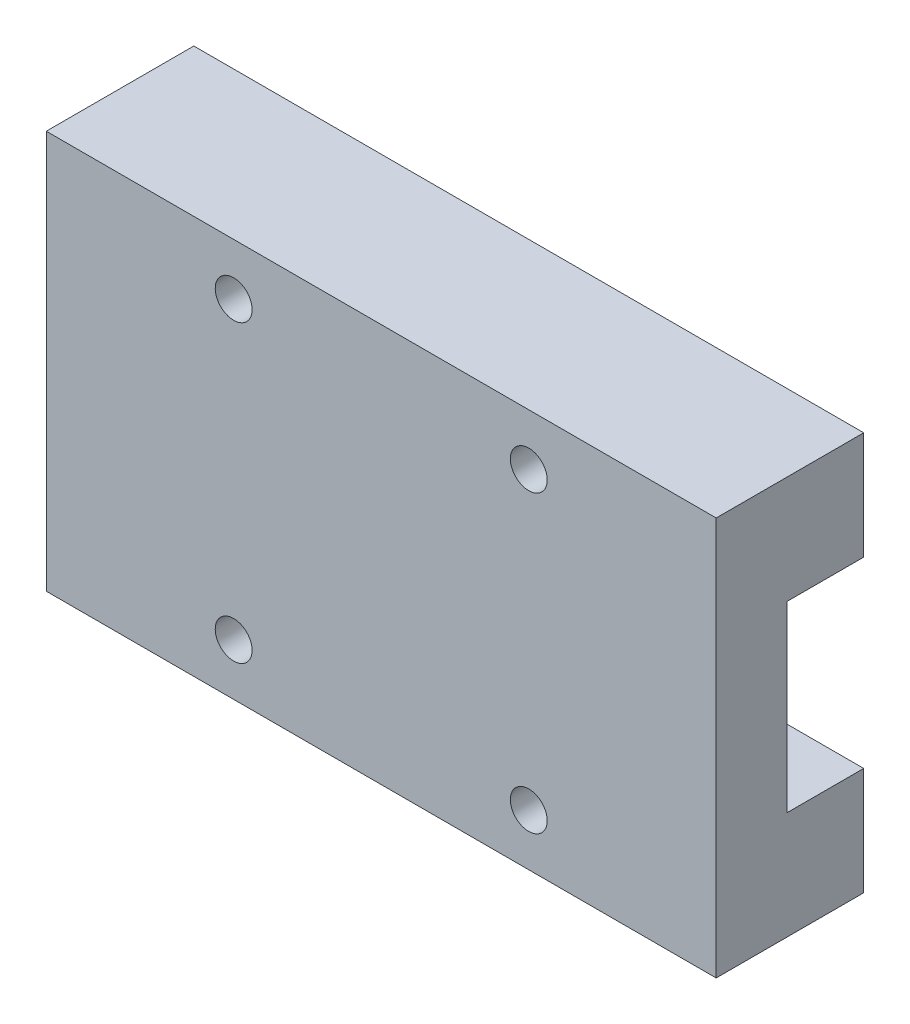
ISO-10303-21;
HEADER;
FILE_DESCRIPTION(('STEP AP214'),'2;1');
FILE_NAME('part.step','',(''),(''),'','','');
FILE_SCHEMA(('AUTOMOTIVE_DESIGN { 1 0 10303 214 1 1 1 1 }'));
ENDSEC;
DATA;
#1=APPLICATION_CONTEXT('core data for automotive mechanical design processes');
#2=APPLICATION_PROTOCOL_DEFINITION('international standard','automotive_design',2000,#1);
#3=PRODUCT_CONTEXT('',#1,'mechanical');
#4=PRODUCT('Part','Part','',(#3));
#5=PRODUCT_RELATED_PRODUCT_CATEGORY('part','',(#4));
#6=PRODUCT_DEFINITION_FORMATION('','',#4);
#7=PRODUCT_DEFINITION_CONTEXT('part definition',#1,'design');
#8=PRODUCT_DEFINITION('design','',#6,#7);
#9=PRODUCT_DEFINITION_SHAPE('','',#8);
#10=(LENGTH_UNIT() NAMED_UNIT(*) SI_UNIT(.MILLI.,.METRE.));
#11=(NAMED_UNIT(*) PLANE_ANGLE_UNIT() SI_UNIT($,.RADIAN.));
#12=(NAMED_UNIT(*) SI_UNIT($,.STERADIAN.) SOLID_ANGLE_UNIT());
#13=UNCERTAINTY_MEASURE_WITH_UNIT(LENGTH_MEASURE(1.E-05),#10,'distance_accuracy_value','');
#14=(GEOMETRIC_REPRESENTATION_CONTEXT(3) GLOBAL_UNCERTAINTY_ASSIGNED_CONTEXT((#13)) GLOBAL_UNIT_ASSIGNED_CONTEXT((#10,
#11,#12)) REPRESENTATION_CONTEXT('',''));
#15=CARTESIAN_POINT('',(0.,0.,0.));
#16=DIRECTION('',(0.,0.,1.));
#17=DIRECTION('',(1.,0.,0.));
#18=AXIS2_PLACEMENT_3D('',#15,#16,#17);
#19=CARTESIAN_POINT('',(-10.,10.,9.));
#20=DIRECTION('',(0.,0.,1.));
#21=DIRECTION('',(1.,0.,0.));
#22=AXIS2_PLACEMENT_3D('',#19,#20,#21);
#23=PLANE('',#22);
#24=CARTESIAN_POINT('',(-10.,10.,9.));
#25=DIRECTION('',(0.,0.,1.));
#26=DIRECTION('',(0.,1.,0.));
#27=AXIS2_PLACEMENT_3D('',#24,#25,#26);
#28=CIRCLE('',#27,1.25);
#29=CARTESIAN_POINT('',(-10.,11.25,9.));
#30=VERTEX_POINT('',#29);
#31=EDGE_CURVE('E10',#30,#30,#28,.T.);
#32=ORIENTED_EDGE('',*,*,#31,.T.);
#33=EDGE_LOOP('',(#32));
#34=FACE_BOUND('',#33,.T.);
#35=ADVANCED_FACE('F16',(#34),#23,.T.);
#36=CARTESIAN_POINT('',(-10.,-10.,9.));
#37=DIRECTION('',(0.,0.,1.));
#38=DIRECTION('',(1.,0.,0.));
#39=AXIS2_PLACEMENT_3D('',#36,#37,#38);
#40=PLANE('',#39);
#41=CARTESIAN_POINT('',(-10.,-10.,9.));
#42=DIRECTION('',(0.,0.,1.));
#43=DIRECTION('',(0.,1.,0.));
#44=AXIS2_PLACEMENT_3D('',#41,#42,#43);
#45=CIRCLE('',#44,1.25);
#46=CARTESIAN_POINT('',(-10.,-8.75,9.));
#47=VERTEX_POINT('',#46);
#48=EDGE_CURVE('E19',#47,#47,#45,.T.);
#49=ORIENTED_EDGE('',*,*,#48,.T.);
#50=EDGE_LOOP('',(#49));
#51=FACE_BOUND('',#50,.T.);
#52=ADVANCED_FACE('F233',(#51),#40,.T.);
#53=CARTESIAN_POINT('',(10.,10.,9.));
#54=DIRECTION('',(0.,0.,1.));
#55=DIRECTION('',(1.,0.,0.));
#56=AXIS2_PLACEMENT_3D('',#53,#54,#55);
#57=PLANE('',#56);
#58=CARTESIAN_POINT('',(10.,10.,9.));
#59=DIRECTION('',(0.,0.,1.));
#60=DIRECTION('',(0.,1.,0.));
#61=AXIS2_PLACEMENT_3D('',#58,#59,#60);
#62=CIRCLE('',#61,1.25);
#63=CARTESIAN_POINT('',(10.,11.25,9.));
#64=VERTEX_POINT('',#63);
#65=EDGE_CURVE('E174',#64,#64,#62,.T.);
#66=ORIENTED_EDGE('',*,*,#65,.T.);
#67=EDGE_LOOP('',(#66));
#68=FACE_BOUND('',#67,.T.);
#69=ADVANCED_FACE('F258',(#68),#57,.T.);
#70=CARTESIAN_POINT('',(10.,-10.,9.));
#71=DIRECTION('',(0.,0.,1.));
#72=DIRECTION('',(1.,0.,0.));
#73=AXIS2_PLACEMENT_3D('',#70,#71,#72);
#74=PLANE('',#73);
#75=CARTESIAN_POINT('',(10.,-10.,9.));
#76=DIRECTION('',(0.,0.,1.));
#77=DIRECTION('',(0.,1.,0.));
#78=AXIS2_PLACEMENT_3D('',#75,#76,#77);
#79=CIRCLE('',#78,1.25);
#80=CARTESIAN_POINT('',(10.,-8.75,9.));
#81=VERTEX_POINT('',#80);
#82=EDGE_CURVE('E170',#81,#81,#79,.T.);
#83=ORIENTED_EDGE('',*,*,#82,.T.);
#84=EDGE_LOOP('',(#83));
#85=FACE_BOUND('',#84,.T.);
#86=ADVANCED_FACE('F249',(#85),#74,.T.);
#87=CARTESIAN_POINT('',(-10.,10.,9.));
#88=DIRECTION('',(0.,0.,1.));
#89=DIRECTION('',(0.,1.,0.));
#90=AXIS2_PLACEMENT_3D('',#87,#88,#89);
#91=CYLINDRICAL_SURFACE('',#90,1.25);
#92=CARTESIAN_POINT('',(-10.,10.,13.));
#93=DIRECTION('',(0.,0.,1.));
#94=DIRECTION('',(0.,1.,0.));
#95=AXIS2_PLACEMENT_3D('',#92,#93,#94);
#96=CIRCLE('',#95,1.25);
#97=CARTESIAN_POINT('',(-10.,11.25,13.));
#98=VERTEX_POINT('',#97);
#99=EDGE_CURVE('E165',#98,#98,#96,.T.);
#100=ORIENTED_EDGE('',*,*,#99,.T.);
#101=EDGE_LOOP('',(#100));
#102=FACE_BOUND('',#101,.T.);
#103=ORIENTED_EDGE('',*,*,#31,.F.);
#104=EDGE_LOOP('',(#103));
#105=FACE_BOUND('',#104,.T.);
#106=ADVANCED_FACE('F238',(#102,#105),#91,.F.);
#107=CARTESIAN_POINT('',(-10.,-10.,9.));
#108=DIRECTION('',(0.,0.,1.));
#109=DIRECTION('',(0.,1.,0.));
#110=AXIS2_PLACEMENT_3D('',#107,#108,#109);
#111=CYLINDRICAL_SURFACE('',#110,1.25);
#112=CARTESIAN_POINT('',(-10.,-10.,13.));
#113=DIRECTION('',(0.,0.,1.));
#114=DIRECTION('',(0.,1.,0.));
#115=AXIS2_PLACEMENT_3D('',#112,#113,#114);
#116=CIRCLE('',#115,1.25);
#117=CARTESIAN_POINT('',(-10.,-8.75,13.));
#118=VERTEX_POINT('',#117);
#119=EDGE_CURVE('E162',#118,#118,#116,.T.);
#120=ORIENTED_EDGE('',*,*,#119,.T.);
#121=EDGE_LOOP('',(#120));
#122=FACE_BOUND('',#121,.T.);
#123=ORIENTED_EDGE('',*,*,#48,.F.);
#124=EDGE_LOOP('',(#123));
#125=FACE_BOUND('',#124,.T.);
#126=ADVANCED_FACE('F235',(#122,#125),#111,.F.);
#127=CARTESIAN_POINT('',(10.,10.,9.));
#128=DIRECTION('',(0.,0.,1.));
#129=DIRECTION('',(0.,1.,0.));
#130=AXIS2_PLACEMENT_3D('',#127,#128,#129);
#131=CYLINDRICAL_SURFACE('',#130,1.25);
#132=CARTESIAN_POINT('',(10.,10.,13.));
#133=DIRECTION('',(0.,0.,1.));
#134=DIRECTION('',(0.,1.,0.));
#135=AXIS2_PLACEMENT_3D('',#132,#133,#134);
#136=CIRCLE('',#135,1.25);
#137=CARTESIAN_POINT('',(10.,11.25,13.));
#138=VERTEX_POINT('',#137);
#139=EDGE_CURVE('E166',#138,#138,#136,.T.);
#140=ORIENTED_EDGE('',*,*,#139,.T.);
#141=EDGE_LOOP('',(#140));
#142=FACE_BOUND('',#141,.T.);
#143=ORIENTED_EDGE('',*,*,#65,.F.);
#144=EDGE_LOOP('',(#143));
#145=FACE_BOUND('',#144,.T.);
#146=ADVANCED_FACE('F237',(#142,#145),#131,.F.);
#147=CARTESIAN_POINT('',(10.,-10.,9.));
#148=DIRECTION('',(0.,0.,1.));
#149=DIRECTION('',(0.,1.,0.));
#150=AXIS2_PLACEMENT_3D('',#147,#148,#149);
#151=CYLINDRICAL_SURFACE('',#150,1.25);
#152=CARTESIAN_POINT('',(10.,-10.,13.));
#153=DIRECTION('',(0.,0.,1.));
#154=DIRECTION('',(0.,1.,0.));
#155=AXIS2_PLACEMENT_3D('',#152,#153,#154);
#156=CIRCLE('',#155,1.25);
#157=CARTESIAN_POINT('',(10.,-8.75,13.));
#158=VERTEX_POINT('',#157);
#159=EDGE_CURVE('E182',#158,#158,#156,.T.);
#160=ORIENTED_EDGE('',*,*,#159,.T.);
#161=EDGE_LOOP('',(#160));
#162=FACE_BOUND('',#161,.T.);
#163=ORIENTED_EDGE('',*,*,#82,.F.);
#164=EDGE_LOOP('',(#163));
#165=FACE_BOUND('',#164,.T.);
#166=ADVANCED_FACE('F246',(#162,#165),#151,.F.);
#167=CARTESIAN_POINT('',(22.7,13.5,3.));
#168=DIRECTION('',(0.,1.,0.));
#169=DIRECTION('',(1.,0.,0.));
#170=AXIS2_PLACEMENT_3D('',#167,#168,#169);
#171=PLANE('',#170);
#172=DIRECTION('',(0.,0.,1.));
#173=VECTOR('',#172,1.);
#174=CARTESIAN_POINT('',(22.7,13.5,3.));
#175=LINE('',#174,#173);
#176=CARTESIAN_POINT('',(22.7,13.5,3.));
#177=VERTEX_POINT('',#176);
#178=CARTESIAN_POINT('',(22.7,13.5,13.));
#179=VERTEX_POINT('',#178);
#180=EDGE_CURVE('E115',#177,#179,#175,.T.);
#181=ORIENTED_EDGE('',*,*,#180,.F.);
#182=DIRECTION('',(-1.,0.,0.));
#183=VECTOR('',#182,1.);
#184=CARTESIAN_POINT('',(22.7,13.5,3.));
#185=LINE('',#184,#183);
#186=CARTESIAN_POINT('',(-22.7,13.5,3.));
#187=VERTEX_POINT('',#186);
#188=EDGE_CURVE('E175',#177,#187,#185,.T.);
#189=ORIENTED_EDGE('',*,*,#188,.T.);
#190=DIRECTION('',(0.,0.,1.));
#191=VECTOR('',#190,1.);
#192=CARTESIAN_POINT('',(-22.7,13.5,3.));
#193=LINE('',#192,#191);
#194=CARTESIAN_POINT('',(-22.7,13.5,13.));
#195=VERTEX_POINT('',#194);
#196=EDGE_CURVE('E196',#187,#195,#193,.T.);
#197=ORIENTED_EDGE('',*,*,#196,.T.);
#198=DIRECTION('',(-1.,0.,0.));
#199=VECTOR('',#198,1.);
#200=CARTESIAN_POINT('',(22.7,13.5,13.));
#201=LINE('',#200,#199);
#202=EDGE_CURVE('E157',#179,#195,#201,.T.);
#203=ORIENTED_EDGE('',*,*,#202,.F.);
#204=EDGE_LOOP('',(#181,#189,#197,#203));
#205=FACE_BOUND('',#204,.T.);
#206=ADVANCED_FACE('F271',(#205),#171,.T.);
#207=CARTESIAN_POINT('',(22.7,-13.5,3.));
#208=DIRECTION('',(0.,0.,1.));
#209=DIRECTION('',(1.,0.,0.));
#210=AXIS2_PLACEMENT_3D('',#207,#208,#209);
#211=PLANE('',#210);
#212=ORIENTED_EDGE('',*,*,#188,.F.);
#213=DIRECTION('',(0.,1.,0.));
#214=VECTOR('',#213,1.);
#215=CARTESIAN_POINT('',(22.7,-13.5,3.));
#216=LINE('',#215,#214);
#217=CARTESIAN_POINT('',(22.7,6.2,3.));
#218=VERTEX_POINT('',#217);
#219=EDGE_CURVE('E161',#218,#177,#216,.T.);
#220=ORIENTED_EDGE('',*,*,#219,.F.);
#221=DIRECTION('',(-1.,0.,0.));
#222=VECTOR('',#221,1.);
#223=CARTESIAN_POINT('',(23.2,6.2,3.));
#224=LINE('',#223,#222);
#225=CARTESIAN_POINT('',(-22.7,6.2,3.));
#226=VERTEX_POINT('',#225);
#227=EDGE_CURVE('E214',#218,#226,#224,.T.);
#228=ORIENTED_EDGE('',*,*,#227,.T.);
#229=DIRECTION('',(0.,1.,0.));
#230=VECTOR('',#229,1.);
#231=CARTESIAN_POINT('',(-22.7,-13.5,3.));
#232=LINE('',#231,#230);
#233=EDGE_CURVE('E199',#226,#187,#232,.T.);
#234=ORIENTED_EDGE('',*,*,#233,.T.);
#235=EDGE_LOOP('',(#212,#220,#228,#234));
#236=FACE_BOUND('',#235,.T.);
#237=ADVANCED_FACE('F275',(#236),#211,.F.);
#238=CARTESIAN_POINT('',(23.7,6.2,2.));
#239=DIRECTION('',(0.,1.,0.));
#240=DIRECTION('',(1.,0.,0.));
#241=AXIS2_PLACEMENT_3D('',#238,#239,#240);
#242=PLANE('',#241);
#243=DIRECTION('',(0.,0.,-1.));
#244=VECTOR('',#243,1.);
#245=CARTESIAN_POINT('',(-22.7,6.2,2.5));
#246=LINE('',#245,#244);
#247=CARTESIAN_POINT('',(-22.7,6.2,8.2));
#248=VERTEX_POINT('',#247);
#249=EDGE_CURVE('E203',#248,#226,#246,.T.);
#250=ORIENTED_EDGE('',*,*,#249,.T.);
#251=ORIENTED_EDGE('',*,*,#227,.F.);
#252=DIRECTION('',(0.,0.,-1.));
#253=VECTOR('',#252,1.);
#254=CARTESIAN_POINT('',(22.7,6.2,2.5));
#255=LINE('',#254,#253);
#256=CARTESIAN_POINT('',(22.7,6.2,8.2));
#257=VERTEX_POINT('',#256);
#258=EDGE_CURVE('E154',#257,#218,#255,.T.);
#259=ORIENTED_EDGE('',*,*,#258,.F.);
#260=DIRECTION('',(-1.,0.,0.));
#261=VECTOR('',#260,1.);
#262=CARTESIAN_POINT('',(23.7,6.2,8.2));
#263=LINE('',#262,#261);
#264=EDGE_CURVE('E47',#257,#248,#263,.T.);
#265=ORIENTED_EDGE('',*,*,#264,.T.);
#266=EDGE_LOOP('',(#250,#251,#259,#265));
#267=FACE_BOUND('',#266,.T.);
#268=ADVANCED_FACE('F277',(#267),#242,.F.);
#269=CARTESIAN_POINT('',(23.7,-6.2,8.2));
#270=DIRECTION('',(0.,0.,1.));
#271=DIRECTION('',(1.,0.,0.));
#272=AXIS2_PLACEMENT_3D('',#269,#270,#271);
#273=PLANE('',#272);
#274=DIRECTION('',(0.,1.,0.));
#275=VECTOR('',#274,1.);
#276=CARTESIAN_POINT('',(-22.7,-9.85,8.2));
#277=LINE('',#276,#275);
#278=CARTESIAN_POINT('',(-22.7,-6.2,8.2));
#279=VERTEX_POINT('',#278);
#280=EDGE_CURVE('E206',#279,#248,#277,.T.);
#281=ORIENTED_EDGE('',*,*,#280,.T.);
#282=ORIENTED_EDGE('',*,*,#264,.F.);
#283=DIRECTION('',(0.,1.,0.));
#284=VECTOR('',#283,1.);
#285=CARTESIAN_POINT('',(22.7,-9.85,8.2));
#286=LINE('',#285,#284);
#287=CARTESIAN_POINT('',(22.7,-6.2,8.2));
#288=VERTEX_POINT('',#287);
#289=EDGE_CURVE('E150',#288,#257,#286,.T.);
#290=ORIENTED_EDGE('',*,*,#289,.F.);
#291=DIRECTION('',(-1.,0.,0.));
#292=VECTOR('',#291,1.);
#293=CARTESIAN_POINT('',(23.7,-6.2,8.2));
#294=LINE('',#293,#292);
#295=EDGE_CURVE('E37',#288,#279,#294,.T.);
#296=ORIENTED_EDGE('',*,*,#295,.T.);
#297=EDGE_LOOP('',(#281,#282,#290,#296));
#298=FACE_BOUND('',#297,.T.);
#299=ADVANCED_FACE('F279',(#298),#273,.F.);
#300=CARTESIAN_POINT('',(23.7,-6.2,2.));
#301=DIRECTION('',(0.,1.,0.));
#302=DIRECTION('',(1.,0.,0.));
#303=AXIS2_PLACEMENT_3D('',#300,#301,#302);
#304=PLANE('',#303);
#305=ORIENTED_EDGE('',*,*,#295,.F.);
#306=DIRECTION('',(0.,0.,-1.));
#307=VECTOR('',#306,1.);
#308=CARTESIAN_POINT('',(22.7,-6.2,2.5));
#309=LINE('',#308,#307);
#310=CARTESIAN_POINT('',(22.7,-6.2,3.));
#311=VERTEX_POINT('',#310);
#312=EDGE_CURVE('E130',#288,#311,#309,.T.);
#313=ORIENTED_EDGE('',*,*,#312,.T.);
#314=DIRECTION('',(-1.,0.,0.));
#315=VECTOR('',#314,1.);
#316=CARTESIAN_POINT('',(23.2,-6.2,3.));
#317=LINE('',#316,#315);
#318=CARTESIAN_POINT('',(-22.7,-6.2,3.));
#319=VERTEX_POINT('',#318);
#320=EDGE_CURVE('E213',#311,#319,#317,.T.);
#321=ORIENTED_EDGE('',*,*,#320,.T.);
#322=DIRECTION('',(0.,0.,-1.));
#323=VECTOR('',#322,1.);
#324=CARTESIAN_POINT('',(-22.7,-6.2,2.5));
#325=LINE('',#324,#323);
#326=EDGE_CURVE('E209',#279,#319,#325,.T.);
#327=ORIENTED_EDGE('',*,*,#326,.F.);
#328=EDGE_LOOP('',(#305,#313,#321,#327));
#329=FACE_BOUND('',#328,.T.);
#330=ADVANCED_FACE('F283',(#329),#304,.T.);
#331=CARTESIAN_POINT('',(22.7,-13.5,3.));
#332=DIRECTION('',(0.,0.,1.));
#333=DIRECTION('',(1.,0.,0.));
#334=AXIS2_PLACEMENT_3D('',#331,#332,#333);
#335=PLANE('',#334);
#336=ORIENTED_EDGE('',*,*,#320,.F.);
#337=DIRECTION('',(0.,1.,0.));
#338=VECTOR('',#337,1.);
#339=CARTESIAN_POINT('',(22.7,-13.5,3.));
#340=LINE('',#339,#338);
#341=CARTESIAN_POINT('',(22.7,-13.5,3.));
#342=VERTEX_POINT('',#341);
#343=EDGE_CURVE('E120',#342,#311,#340,.T.);
#344=ORIENTED_EDGE('',*,*,#343,.F.);
#345=DIRECTION('',(-1.,0.,0.));
#346=VECTOR('',#345,1.);
#347=CARTESIAN_POINT('',(22.7,-13.5,3.));
#348=LINE('',#347,#346);
#349=CARTESIAN_POINT('',(-22.7,-13.5,3.));
#350=VERTEX_POINT('',#349);
#351=EDGE_CURVE('E128',#342,#350,#348,.T.);
#352=ORIENTED_EDGE('',*,*,#351,.T.);
#353=DIRECTION('',(0.,1.,0.));
#354=VECTOR('',#353,1.);
#355=CARTESIAN_POINT('',(-22.7,-13.5,3.));
#356=LINE('',#355,#354);
#357=EDGE_CURVE('E192',#350,#319,#356,.T.);
#358=ORIENTED_EDGE('',*,*,#357,.T.);
#359=EDGE_LOOP('',(#336,#344,#352,#358));
#360=FACE_BOUND('',#359,.T.);
#361=ADVANCED_FACE('F286',(#360),#335,.F.);
#362=CARTESIAN_POINT('',(-22.7,-13.5,3.));
#363=DIRECTION('',(-1.,0.,0.));
#364=DIRECTION('',(0.,0.,1.));
#365=AXIS2_PLACEMENT_3D('',#362,#363,#364);
#366=PLANE('',#365);
#367=ORIENTED_EDGE('',*,*,#357,.F.);
#368=DIRECTION('',(0.,0.,1.));
#369=VECTOR('',#368,1.);
#370=CARTESIAN_POINT('',(-22.7,-13.5,3.));
#371=LINE('',#370,#369);
#372=CARTESIAN_POINT('',(-22.7,-13.5,13.));
#373=VERTEX_POINT('',#372);
#374=EDGE_CURVE('E137',#350,#373,#371,.T.);
#375=ORIENTED_EDGE('',*,*,#374,.T.);
#376=DIRECTION('',(0.,1.,0.));
#377=VECTOR('',#376,1.);
#378=CARTESIAN_POINT('',(-22.7,-13.5,13.));
#379=LINE('',#378,#377);
#380=EDGE_CURVE('E134',#373,#195,#379,.T.);
#381=ORIENTED_EDGE('',*,*,#380,.T.);
#382=ORIENTED_EDGE('',*,*,#196,.F.);
#383=ORIENTED_EDGE('',*,*,#233,.F.);
#384=ORIENTED_EDGE('',*,*,#249,.F.);
#385=ORIENTED_EDGE('',*,*,#280,.F.);
#386=ORIENTED_EDGE('',*,*,#326,.T.);
#387=EDGE_LOOP('',(#367,#375,#381,#382,#383,#384,#385,#386));
#388=FACE_BOUND('',#387,.T.);
#389=ADVANCED_FACE('F289',(#388),#366,.T.);
#390=CARTESIAN_POINT('',(22.7,-13.5,13.));
#391=DIRECTION('',(0.,0.,1.));
#392=DIRECTION('',(1.,0.,0.));
#393=AXIS2_PLACEMENT_3D('',#390,#391,#392);
#394=PLANE('',#393);
#395=ORIENTED_EDGE('',*,*,#99,.F.);
#396=EDGE_LOOP('',(#395));
#397=FACE_BOUND('',#396,.T.);
#398=ORIENTED_EDGE('',*,*,#119,.F.);
#399=EDGE_LOOP('',(#398));
#400=FACE_BOUND('',#399,.T.);
#401=ORIENTED_EDGE('',*,*,#139,.F.);
#402=EDGE_LOOP('',(#401));
#403=FACE_BOUND('',#402,.T.);
#404=ORIENTED_EDGE('',*,*,#159,.F.);
#405=EDGE_LOOP('',(#404));
#406=FACE_BOUND('',#405,.T.);
#407=DIRECTION('',(-1.,0.,0.));
#408=VECTOR('',#407,1.);
#409=CARTESIAN_POINT('',(22.7,-13.5,13.));
#410=LINE('',#409,#408);
#411=CARTESIAN_POINT('',(22.7,-13.5,13.));
#412=VERTEX_POINT('',#411);
#413=EDGE_CURVE('E126',#412,#373,#410,.T.);
#414=ORIENTED_EDGE('',*,*,#413,.F.);
#415=DIRECTION('',(0.,1.,0.));
#416=VECTOR('',#415,1.);
#417=CARTESIAN_POINT('',(22.7,-13.5,13.));
#418=LINE('',#417,#416);
#419=EDGE_CURVE('E106',#412,#179,#418,.T.);
#420=ORIENTED_EDGE('',*,*,#419,.T.);
#421=ORIENTED_EDGE('',*,*,#202,.T.);
#422=ORIENTED_EDGE('',*,*,#380,.F.);
#423=EDGE_LOOP('',(#414,#420,#421,#422));
#424=FACE_BOUND('',#423,.T.);
#425=ADVANCED_FACE('F132',(#397,#400,#403,#406,#424),#394,.T.);
#426=CARTESIAN_POINT('',(22.7,-13.5,3.));
#427=DIRECTION('',(-1.,0.,0.));
#428=DIRECTION('',(0.,0.,1.));
#429=AXIS2_PLACEMENT_3D('',#426,#427,#428);
#430=PLANE('',#429);
#431=ORIENTED_EDGE('',*,*,#312,.F.);
#432=ORIENTED_EDGE('',*,*,#289,.T.);
#433=ORIENTED_EDGE('',*,*,#258,.T.);
#434=ORIENTED_EDGE('',*,*,#219,.T.);
#435=ORIENTED_EDGE('',*,*,#180,.T.);
#436=ORIENTED_EDGE('',*,*,#419,.F.);
#437=DIRECTION('',(0.,0.,1.));
#438=VECTOR('',#437,1.);
#439=CARTESIAN_POINT('',(22.7,-13.5,3.));
#440=LINE('',#439,#438);
#441=EDGE_CURVE('E111',#342,#412,#440,.T.);
#442=ORIENTED_EDGE('',*,*,#441,.F.);
#443=ORIENTED_EDGE('',*,*,#343,.T.);
#444=EDGE_LOOP('',(#431,#432,#433,#434,#435,#436,#442,#443));
#445=FACE_BOUND('',#444,.T.);
#446=ADVANCED_FACE('F109',(#445),#430,.F.);
#447=CARTESIAN_POINT('',(22.7,-13.5,3.));
#448=DIRECTION('',(0.,1.,0.));
#449=DIRECTION('',(1.,0.,0.));
#450=AXIS2_PLACEMENT_3D('',#447,#448,#449);
#451=PLANE('',#450);
#452=ORIENTED_EDGE('',*,*,#413,.T.);
#453=ORIENTED_EDGE('',*,*,#374,.F.);
#454=ORIENTED_EDGE('',*,*,#351,.F.);
#455=ORIENTED_EDGE('',*,*,#441,.T.);
#456=EDGE_LOOP('',(#452,#453,#454,#455));
#457=FACE_BOUND('',#456,.T.);
#458=ADVANCED_FACE('F124',(#457),#451,.F.);
#459=CLOSED_SHELL('',(#35,#52,#69,#86,#106,#126,#146,#166,#206,#237,#268,#299,#330,#361,#389,
#425,#446,#458));
#460=MANIFOLD_SOLID_BREP('B1',#459);
#461=ADVANCED_BREP_SHAPE_REPRESENTATION('',(#18,#460),#14);
#462=SHAPE_DEFINITION_REPRESENTATION(#9,#461);
ENDSEC;
END-ISO-10303-21;
